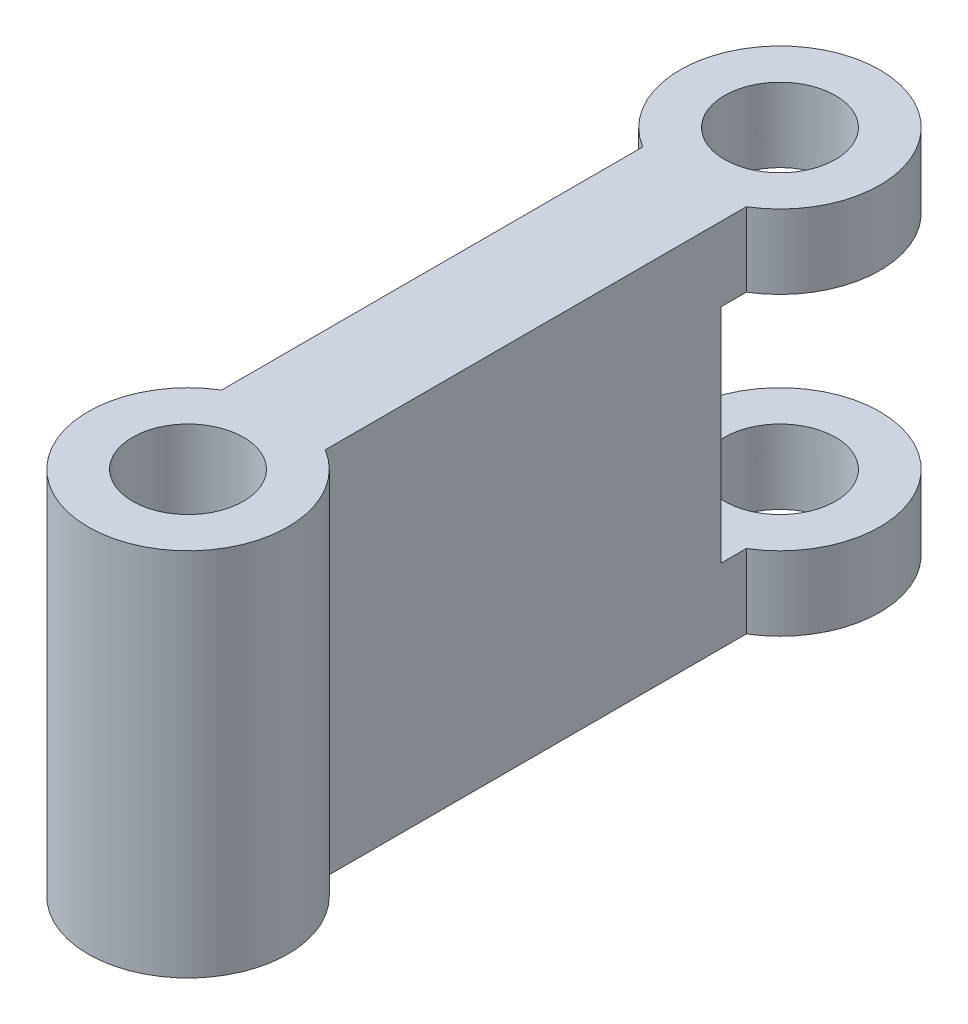
ISO-10303-21;
HEADER;
FILE_DESCRIPTION(('STEP AP214'),'2;1');
FILE_NAME('part.step','',(''),(''),'','','');
FILE_SCHEMA(('AUTOMOTIVE_DESIGN { 1 0 10303 214 1 1 1 1 }'));
ENDSEC;
DATA;
#1=APPLICATION_CONTEXT('core data for automotive mechanical design processes');
#2=APPLICATION_PROTOCOL_DEFINITION('international standard','automotive_design',2000,#1);
#3=PRODUCT_CONTEXT('',#1,'mechanical');
#4=PRODUCT('Part','Part','',(#3));
#5=PRODUCT_RELATED_PRODUCT_CATEGORY('part','',(#4));
#6=PRODUCT_DEFINITION_FORMATION('','',#4);
#7=PRODUCT_DEFINITION_CONTEXT('part definition',#1,'design');
#8=PRODUCT_DEFINITION('design','',#6,#7);
#9=PRODUCT_DEFINITION_SHAPE('','',#8);
#10=(LENGTH_UNIT() NAMED_UNIT(*) SI_UNIT(.MILLI.,.METRE.));
#11=(NAMED_UNIT(*) PLANE_ANGLE_UNIT() SI_UNIT($,.RADIAN.));
#12=(NAMED_UNIT(*) SI_UNIT($,.STERADIAN.) SOLID_ANGLE_UNIT());
#13=UNCERTAINTY_MEASURE_WITH_UNIT(LENGTH_MEASURE(1.E-05),#10,'distance_accuracy_value','');
#14=(GEOMETRIC_REPRESENTATION_CONTEXT(3) GLOBAL_UNCERTAINTY_ASSIGNED_CONTEXT((#13)) GLOBAL_UNIT_ASSIGNED_CONTEXT((#10,
#11,#12)) REPRESENTATION_CONTEXT('',''));
#15=CARTESIAN_POINT('',(0.,0.,0.));
#16=DIRECTION('',(0.,0.,1.));
#17=DIRECTION('',(1.,0.,0.));
#18=AXIS2_PLACEMENT_3D('',#15,#16,#17);
#19=CARTESIAN_POINT('',(0.,10.,0.));
#20=DIRECTION('',(0.,-1.,0.));
#21=DIRECTION('',(0.,0.,-1.00000000000001));
#22=AXIS2_PLACEMENT_3D('',#19,#20,#21);
#23=CYLINDRICAL_SURFACE('',#22,2.7);
#24=CARTESIAN_POINT('',(0.,8.,0.));
#25=DIRECTION('',(0.,-1.,0.));
#26=DIRECTION('',(0.,0.,-1.00000000000001));
#27=AXIS2_PLACEMENT_3D('',#24,#25,#26);
#28=CIRCLE('',#27,2.7);
#29=CARTESIAN_POINT('',(-1.4,8.,2.30867927612299));
#30=VERTEX_POINT('',#29);
#31=CARTESIAN_POINT('',(1.4,8.,2.30867927612305));
#32=VERTEX_POINT('',#31);
#33=EDGE_CURVE('E57',#30,#32,#28,.T.);
#34=ORIENTED_EDGE('',*,*,#33,.F.);
#35=DIRECTION('',(0.,-1.,0.));
#36=VECTOR('',#35,1.);
#37=CARTESIAN_POINT('',(-1.4,10.,2.30867927612301));
#38=LINE('',#37,#36);
#39=CARTESIAN_POINT('',(-1.4,10.,2.30867927612301));
#40=VERTEX_POINT('',#39);
#41=EDGE_CURVE('E11',#40,#30,#38,.T.);
#42=ORIENTED_EDGE('',*,*,#41,.F.);
#43=CARTESIAN_POINT('',(0.,10.,0.));
#44=DIRECTION('',(0.,1.,0.));
#45=DIRECTION('',(0.,0.,1.00000000000001));
#46=AXIS2_PLACEMENT_3D('',#43,#44,#45);
#47=CIRCLE('',#46,2.7);
#48=CARTESIAN_POINT('',(1.40000000000005,10.,2.30867927612308));
#49=VERTEX_POINT('',#48);
#50=EDGE_CURVE('E186',#49,#40,#47,.T.);
#51=ORIENTED_EDGE('',*,*,#50,.F.);
#52=DIRECTION('',(0.,-1.,0.));
#53=VECTOR('',#52,1.);
#54=CARTESIAN_POINT('',(1.40000000000005,10.,2.30867927612308));
#55=LINE('',#54,#53);
#56=EDGE_CURVE('E121',#49,#32,#55,.T.);
#57=ORIENTED_EDGE('',*,*,#56,.T.);
#58=EDGE_LOOP('',(#34,#42,#51,#57));
#59=FACE_BOUND('',#58,.T.);
#60=ADVANCED_FACE('F39',(#59),#23,.T.);
#61=CARTESIAN_POINT('',(0.,10.,0.));
#62=DIRECTION('',(0.,-1.,0.));
#63=DIRECTION('',(0.,0.,-1.00000000000001));
#64=AXIS2_PLACEMENT_3D('',#61,#62,#63);
#65=CYLINDRICAL_SURFACE('',#64,1.5);
#66=CARTESIAN_POINT('',(0.,10.,0.));
#67=DIRECTION('',(0.,1.,0.));
#68=DIRECTION('',(0.,0.,1.00000000000001));
#69=AXIS2_PLACEMENT_3D('',#66,#67,#68);
#70=CIRCLE('',#69,1.5);
#71=CARTESIAN_POINT('',(0.,10.,1.50000000000002));
#72=VERTEX_POINT('',#71);
#73=EDGE_CURVE('E177',#72,#72,#70,.T.);
#74=ORIENTED_EDGE('',*,*,#73,.T.);
#75=EDGE_LOOP('',(#74));
#76=FACE_BOUND('',#75,.T.);
#77=CARTESIAN_POINT('',(0.,8.,0.));
#78=DIRECTION('',(0.,-1.,0.));
#79=DIRECTION('',(0.,0.,-1.00000000000001));
#80=AXIS2_PLACEMENT_3D('',#77,#78,#79);
#81=CIRCLE('',#80,1.5);
#82=CARTESIAN_POINT('',(0.,8.,-1.50000000000001));
#83=VERTEX_POINT('',#82);
#84=EDGE_CURVE('E202',#83,#83,#81,.T.);
#85=ORIENTED_EDGE('',*,*,#84,.T.);
#86=EDGE_LOOP('',(#85));
#87=FACE_BOUND('',#86,.T.);
#88=ADVANCED_FACE('F142',(#76,#87),#65,.F.);
#89=CARTESIAN_POINT('',(0.,10.,0.));
#90=DIRECTION('',(0.,1.,0.));
#91=DIRECTION('',(0.,0.,1.00000000000001));
#92=AXIS2_PLACEMENT_3D('',#89,#90,#91);
#93=PLANE('',#92);
#94=ORIENTED_EDGE('',*,*,#73,.F.);
#95=EDGE_LOOP('',(#94));
#96=FACE_BOUND('',#95,.T.);
#97=ORIENTED_EDGE('',*,*,#50,.T.);
#98=DIRECTION('',(0.,0.,1.00000000000001));
#99=VECTOR('',#98,1.);
#100=CARTESIAN_POINT('',(-1.4,10.,2.30867927612301));
#101=LINE('',#100,#99);
#102=CARTESIAN_POINT('',(-1.4,9.99999999999999,13.691320723877));
#103=VERTEX_POINT('',#102);
#104=EDGE_CURVE('E94',#40,#103,#101,.T.);
#105=ORIENTED_EDGE('',*,*,#104,.T.);
#106=CARTESIAN_POINT('',(0.,10.,16.));
#107=DIRECTION('',(0.,1.,0.));
#108=DIRECTION('',(0.,0.,1.00000000000001));
#109=AXIS2_PLACEMENT_3D('',#106,#107,#108);
#110=CIRCLE('',#109,2.7);
#111=CARTESIAN_POINT('',(1.4,9.99999999999999,13.691320723877));
#112=VERTEX_POINT('',#111);
#113=EDGE_CURVE('E190',#103,#112,#110,.T.);
#114=ORIENTED_EDGE('',*,*,#113,.T.);
#115=DIRECTION('',(0.,0.,-1.00000000000001));
#116=VECTOR('',#115,1.);
#117=CARTESIAN_POINT('',(1.40000000000005,10.,2.30867927612308));
#118=LINE('',#117,#116);
#119=EDGE_CURVE('E62',#112,#49,#118,.T.);
#120=ORIENTED_EDGE('',*,*,#119,.T.);
#121=EDGE_LOOP('',(#97,#105,#114,#120));
#122=FACE_BOUND('',#121,.T.);
#123=CARTESIAN_POINT('',(0.,10.,16.));
#124=DIRECTION('',(0.,1.,0.));
#125=DIRECTION('',(0.,0.,1.00000000000001));
#126=AXIS2_PLACEMENT_3D('',#123,#124,#125);
#127=CIRCLE('',#126,1.5);
#128=CARTESIAN_POINT('',(0.,10.,17.5));
#129=VERTEX_POINT('',#128);
#130=EDGE_CURVE('E180',#129,#129,#127,.T.);
#131=ORIENTED_EDGE('',*,*,#130,.F.);
#132=EDGE_LOOP('',(#131));
#133=FACE_BOUND('',#132,.T.);
#134=ADVANCED_FACE('F148',(#96,#122,#133),#93,.T.);
#135=CARTESIAN_POINT('',(0.,0.,0.));
#136=DIRECTION('',(0.,1.,0.));
#137=DIRECTION('',(0.,0.,1.00000000000001));
#138=AXIS2_PLACEMENT_3D('',#135,#136,#137);
#139=PLANE('',#138);
#140=CARTESIAN_POINT('',(0.,0.,0.));
#141=DIRECTION('',(0.,1.,0.));
#142=DIRECTION('',(0.,0.,1.00000000000001));
#143=AXIS2_PLACEMENT_3D('',#140,#141,#142);
#144=CIRCLE('',#143,2.7);
#145=CARTESIAN_POINT('',(1.4,0.,2.30867927612305));
#146=VERTEX_POINT('',#145);
#147=CARTESIAN_POINT('',(-1.4,0.,2.30867927612299));
#148=VERTEX_POINT('',#147);
#149=EDGE_CURVE('E179',#146,#148,#144,.T.);
#150=ORIENTED_EDGE('',*,*,#149,.F.);
#151=DIRECTION('',(0.,0.,-1.00000000000001));
#152=VECTOR('',#151,1.);
#153=CARTESIAN_POINT('',(1.4,0.,2.30867927612305));
#154=LINE('',#153,#152);
#155=CARTESIAN_POINT('',(1.4,0.,13.691320723877));
#156=VERTEX_POINT('',#155);
#157=EDGE_CURVE('E189',#156,#146,#154,.T.);
#158=ORIENTED_EDGE('',*,*,#157,.F.);
#159=CARTESIAN_POINT('',(0.,0.,16.));
#160=DIRECTION('',(0.,1.,0.));
#161=DIRECTION('',(0.,0.,1.00000000000001));
#162=AXIS2_PLACEMENT_3D('',#159,#160,#161);
#163=CIRCLE('',#162,2.7);
#164=CARTESIAN_POINT('',(-1.4,0.,13.691320723877));
#165=VERTEX_POINT('',#164);
#166=EDGE_CURVE('E198',#165,#156,#163,.T.);
#167=ORIENTED_EDGE('',*,*,#166,.F.);
#168=DIRECTION('',(0.,0.,1.00000000000001));
#169=VECTOR('',#168,1.);
#170=CARTESIAN_POINT('',(-1.4,0.,2.30867927612299));
#171=LINE('',#170,#169);
#172=EDGE_CURVE('E194',#148,#165,#171,.T.);
#173=ORIENTED_EDGE('',*,*,#172,.F.);
#174=EDGE_LOOP('',(#150,#158,#167,#173));
#175=FACE_BOUND('',#174,.T.);
#176=CARTESIAN_POINT('',(0.,0.,0.));
#177=DIRECTION('',(0.,1.,0.));
#178=DIRECTION('',(0.,0.,1.00000000000001));
#179=AXIS2_PLACEMENT_3D('',#176,#177,#178);
#180=CIRCLE('',#179,1.5);
#181=CARTESIAN_POINT('',(0.,0.,1.50000000000001));
#182=VERTEX_POINT('',#181);
#183=EDGE_CURVE('E174',#182,#182,#180,.T.);
#184=ORIENTED_EDGE('',*,*,#183,.T.);
#185=EDGE_LOOP('',(#184));
#186=FACE_BOUND('',#185,.T.);
#187=CARTESIAN_POINT('',(0.,0.,16.));
#188=DIRECTION('',(0.,1.,0.));
#189=DIRECTION('',(0.,0.,1.00000000000001));
#190=AXIS2_PLACEMENT_3D('',#187,#188,#189);
#191=CIRCLE('',#190,1.5);
#192=CARTESIAN_POINT('',(0.,0.,17.5));
#193=VERTEX_POINT('',#192);
#194=EDGE_CURVE('E185',#193,#193,#191,.T.);
#195=ORIENTED_EDGE('',*,*,#194,.T.);
#196=EDGE_LOOP('',(#195));
#197=FACE_BOUND('',#196,.T.);
#198=ADVANCED_FACE('F136',(#175,#186,#197),#139,.F.);
#199=CARTESIAN_POINT('',(-1.4,2.,2.30867927612304));
#200=VERTEX_POINT('',#199);
#201=EDGE_CURVE('E48',#200,#148,#38,.T.);
#202=ORIENTED_EDGE('',*,*,#201,.F.);
#203=CARTESIAN_POINT('',(0.,2.,0.));
#204=DIRECTION('',(0.,-1.,0.));
#205=DIRECTION('',(0.,0.,-1.00000000000001));
#206=AXIS2_PLACEMENT_3D('',#203,#204,#205);
#207=CIRCLE('',#206,2.7);
#208=CARTESIAN_POINT('',(1.4,2.,2.30867927612305));
#209=VERTEX_POINT('',#208);
#210=EDGE_CURVE('E229',#200,#209,#207,.T.);
#211=ORIENTED_EDGE('',*,*,#210,.T.);
#212=EDGE_CURVE('E87',#209,#146,#55,.T.);
#213=ORIENTED_EDGE('',*,*,#212,.T.);
#214=ORIENTED_EDGE('',*,*,#149,.T.);
#215=EDGE_LOOP('',(#202,#211,#213,#214));
#216=FACE_BOUND('',#215,.T.);
#217=ADVANCED_FACE('F41',(#216),#23,.T.);
#218=CARTESIAN_POINT('',(-1.4,10.,2.30867927612301));
#219=DIRECTION('',(1.00000000000001,0.,0.));
#220=DIRECTION('',(0.,0.,-1.00000000000001));
#221=AXIS2_PLACEMENT_3D('',#218,#219,#220);
#222=PLANE('',#221);
#223=DIRECTION('',(0.,1.,0.));
#224=VECTOR('',#223,1.);
#225=CARTESIAN_POINT('',(-1.4,1.9999999999999,2.99999999999999));
#226=LINE('',#225,#224);
#227=CARTESIAN_POINT('',(-1.4,1.9999999999999,2.99999999999999));
#228=VERTEX_POINT('',#227);
#229=CARTESIAN_POINT('',(-1.39999999999994,7.9999999999999,2.99999999999998));
#230=VERTEX_POINT('',#229);
#231=EDGE_CURVE('E128',#228,#230,#226,.T.);
#232=ORIENTED_EDGE('',*,*,#231,.F.);
#233=DIRECTION('',(0.,0.,-1.00000000000001));
#234=VECTOR('',#233,1.);
#235=CARTESIAN_POINT('',(-1.4,2.,0.));
#236=LINE('',#235,#234);
#237=EDGE_CURVE('E232',#228,#200,#236,.T.);
#238=ORIENTED_EDGE('',*,*,#237,.T.);
#239=ORIENTED_EDGE('',*,*,#201,.T.);
#240=ORIENTED_EDGE('',*,*,#172,.T.);
#241=DIRECTION('',(0.,-1.,0.));
#242=VECTOR('',#241,1.);
#243=CARTESIAN_POINT('',(-1.4,9.99999999999999,13.691320723877));
#244=LINE('',#243,#242);
#245=EDGE_CURVE('E201',#103,#165,#244,.T.);
#246=ORIENTED_EDGE('',*,*,#245,.F.);
#247=ORIENTED_EDGE('',*,*,#104,.F.);
#248=ORIENTED_EDGE('',*,*,#41,.T.);
#249=DIRECTION('',(0.,0.,-1.00000000000001));
#250=VECTOR('',#249,1.);
#251=CARTESIAN_POINT('',(-1.4,8.,0.));
#252=LINE('',#251,#250);
#253=EDGE_CURVE('E113',#230,#30,#252,.T.);
#254=ORIENTED_EDGE('',*,*,#253,.F.);
#255=EDGE_LOOP('',(#232,#238,#239,#240,#246,#247,#248,#254));
#256=FACE_BOUND('',#255,.T.);
#257=ADVANCED_FACE('F126',(#256),#222,.F.);
#258=CARTESIAN_POINT('',(0.,10.,16.));
#259=DIRECTION('',(0.,-1.,0.));
#260=DIRECTION('',(0.,0.,-1.00000000000001));
#261=AXIS2_PLACEMENT_3D('',#258,#259,#260);
#262=CYLINDRICAL_SURFACE('',#261,2.7);
#263=ORIENTED_EDGE('',*,*,#166,.T.);
#264=DIRECTION('',(0.,-1.,0.));
#265=VECTOR('',#264,1.);
#266=CARTESIAN_POINT('',(1.4,9.99999999999999,13.691320723877));
#267=LINE('',#266,#265);
#268=EDGE_CURVE('E199',#112,#156,#267,.T.);
#269=ORIENTED_EDGE('',*,*,#268,.F.);
#270=ORIENTED_EDGE('',*,*,#113,.F.);
#271=ORIENTED_EDGE('',*,*,#245,.T.);
#272=EDGE_LOOP('',(#263,#269,#270,#271));
#273=FACE_BOUND('',#272,.T.);
#274=ADVANCED_FACE('F132',(#273),#262,.T.);
#275=CARTESIAN_POINT('',(1.40000000000005,10.,2.30867927612308));
#276=DIRECTION('',(-1.00000000000001,0.,0.));
#277=DIRECTION('',(0.,0.,1.00000000000001));
#278=AXIS2_PLACEMENT_3D('',#275,#276,#277);
#279=PLANE('',#278);
#280=ORIENTED_EDGE('',*,*,#212,.F.);
#281=DIRECTION('',(0.,0.,-1.00000000000001));
#282=VECTOR('',#281,1.);
#283=CARTESIAN_POINT('',(1.4,2.,0.));
#284=LINE('',#283,#282);
#285=CARTESIAN_POINT('',(1.4,2.,3.00000000000004));
#286=VERTEX_POINT('',#285);
#287=EDGE_CURVE('E231',#286,#209,#284,.T.);
#288=ORIENTED_EDGE('',*,*,#287,.F.);
#289=DIRECTION('',(0.,1.,0.));
#290=VECTOR('',#289,1.);
#291=CARTESIAN_POINT('',(1.4,2.,3.00000000000004));
#292=LINE('',#291,#290);
#293=CARTESIAN_POINT('',(1.40000000000004,8.,3.00000000000002));
#294=VERTEX_POINT('',#293);
#295=EDGE_CURVE('E210',#286,#294,#292,.T.);
#296=ORIENTED_EDGE('',*,*,#295,.T.);
#297=DIRECTION('',(0.,0.,-1.00000000000001));
#298=VECTOR('',#297,1.);
#299=CARTESIAN_POINT('',(1.4,8.,0.));
#300=LINE('',#299,#298);
#301=EDGE_CURVE('E127',#294,#32,#300,.T.);
#302=ORIENTED_EDGE('',*,*,#301,.T.);
#303=ORIENTED_EDGE('',*,*,#56,.F.);
#304=ORIENTED_EDGE('',*,*,#119,.F.);
#305=ORIENTED_EDGE('',*,*,#268,.T.);
#306=ORIENTED_EDGE('',*,*,#157,.T.);
#307=EDGE_LOOP('',(#280,#288,#296,#302,#303,#304,#305,#306));
#308=FACE_BOUND('',#307,.T.);
#309=ADVANCED_FACE('F140',(#308),#279,.F.);
#310=CARTESIAN_POINT('',(0.,2.,0.));
#311=DIRECTION('',(0.,-1.,0.));
#312=DIRECTION('',(0.,0.,-1.00000000000001));
#313=AXIS2_PLACEMENT_3D('',#310,#311,#312);
#314=CIRCLE('',#313,1.5);
#315=CARTESIAN_POINT('',(0.,2.,-1.50000000000001));
#316=VERTEX_POINT('',#315);
#317=EDGE_CURVE('E43',#316,#316,#314,.T.);
#318=ORIENTED_EDGE('',*,*,#317,.F.);
#319=EDGE_LOOP('',(#318));
#320=FACE_BOUND('',#319,.T.);
#321=ORIENTED_EDGE('',*,*,#183,.F.);
#322=EDGE_LOOP('',(#321));
#323=FACE_BOUND('',#322,.T.);
#324=ADVANCED_FACE('F149',(#320,#323),#65,.F.);
#325=CARTESIAN_POINT('',(0.,10.,16.));
#326=DIRECTION('',(0.,-1.,0.));
#327=DIRECTION('',(0.,0.,-1.00000000000001));
#328=AXIS2_PLACEMENT_3D('',#325,#326,#327);
#329=CYLINDRICAL_SURFACE('',#328,1.5);
#330=ORIENTED_EDGE('',*,*,#130,.T.);
#331=EDGE_LOOP('',(#330));
#332=FACE_BOUND('',#331,.T.);
#333=ORIENTED_EDGE('',*,*,#194,.F.);
#334=EDGE_LOOP('',(#333));
#335=FACE_BOUND('',#334,.T.);
#336=ADVANCED_FACE('F157',(#332,#335),#329,.F.);
#337=CARTESIAN_POINT('',(0.,1.9999999999999,3.));
#338=DIRECTION('',(0.,0.,-1.00000000000001));
#339=DIRECTION('',(-1.00000000000001,0.,0.));
#340=AXIS2_PLACEMENT_3D('',#337,#338,#339);
#341=PLANE('',#340);
#342=ORIENTED_EDGE('',*,*,#295,.F.);
#343=DIRECTION('',(-1.00000000000001,0.,0.));
#344=VECTOR('',#343,1.);
#345=CARTESIAN_POINT('',(0.,1.9999999999999,3.));
#346=LINE('',#345,#344);
#347=EDGE_CURVE('E215',#286,#228,#346,.T.);
#348=ORIENTED_EDGE('',*,*,#347,.T.);
#349=ORIENTED_EDGE('',*,*,#231,.T.);
#350=DIRECTION('',(-1.00000000000001,0.,0.));
#351=VECTOR('',#350,1.);
#352=CARTESIAN_POINT('',(0.,7.9999999999999,3.));
#353=LINE('',#352,#351);
#354=EDGE_CURVE('E116',#294,#230,#353,.T.);
#355=ORIENTED_EDGE('',*,*,#354,.F.);
#356=EDGE_LOOP('',(#342,#348,#349,#355));
#357=FACE_BOUND('',#356,.T.);
#358=ADVANCED_FACE('F164',(#357),#341,.T.);
#359=CARTESIAN_POINT('',(0.,2.,0.));
#360=DIRECTION('',(0.,-1.,0.));
#361=DIRECTION('',(0.,0.,-1.00000000000001));
#362=AXIS2_PLACEMENT_3D('',#359,#360,#361);
#363=PLANE('',#362);
#364=ORIENTED_EDGE('',*,*,#317,.T.);
#365=EDGE_LOOP('',(#364));
#366=FACE_BOUND('',#365,.T.);
#367=ORIENTED_EDGE('',*,*,#237,.F.);
#368=ORIENTED_EDGE('',*,*,#347,.F.);
#369=ORIENTED_EDGE('',*,*,#287,.T.);
#370=ORIENTED_EDGE('',*,*,#210,.F.);
#371=EDGE_LOOP('',(#367,#368,#369,#370));
#372=FACE_BOUND('',#371,.T.);
#373=ADVANCED_FACE('F241',(#366,#372),#363,.F.);
#374=CARTESIAN_POINT('',(0.,8.,0.));
#375=DIRECTION('',(0.,-1.,0.));
#376=DIRECTION('',(0.,0.,-1.00000000000001));
#377=AXIS2_PLACEMENT_3D('',#374,#375,#376);
#378=PLANE('',#377);
#379=ORIENTED_EDGE('',*,*,#84,.F.);
#380=EDGE_LOOP('',(#379));
#381=FACE_BOUND('',#380,.T.);
#382=ORIENTED_EDGE('',*,*,#253,.T.);
#383=ORIENTED_EDGE('',*,*,#33,.T.);
#384=ORIENTED_EDGE('',*,*,#301,.F.);
#385=ORIENTED_EDGE('',*,*,#354,.T.);
#386=EDGE_LOOP('',(#382,#383,#384,#385));
#387=FACE_BOUND('',#386,.T.);
#388=ADVANCED_FACE('F118',(#381,#387),#378,.T.);
#389=CLOSED_SHELL('',(#60,#88,#134,#198,#217,#257,#274,#309,#324,#336,#358,#373,#388));
#390=MANIFOLD_SOLID_BREP('B2',#389);
#391=ADVANCED_BREP_SHAPE_REPRESENTATION('',(#18,#390),#14);
#392=SHAPE_DEFINITION_REPRESENTATION(#9,#391);
ENDSEC;
END-ISO-10303-21;
